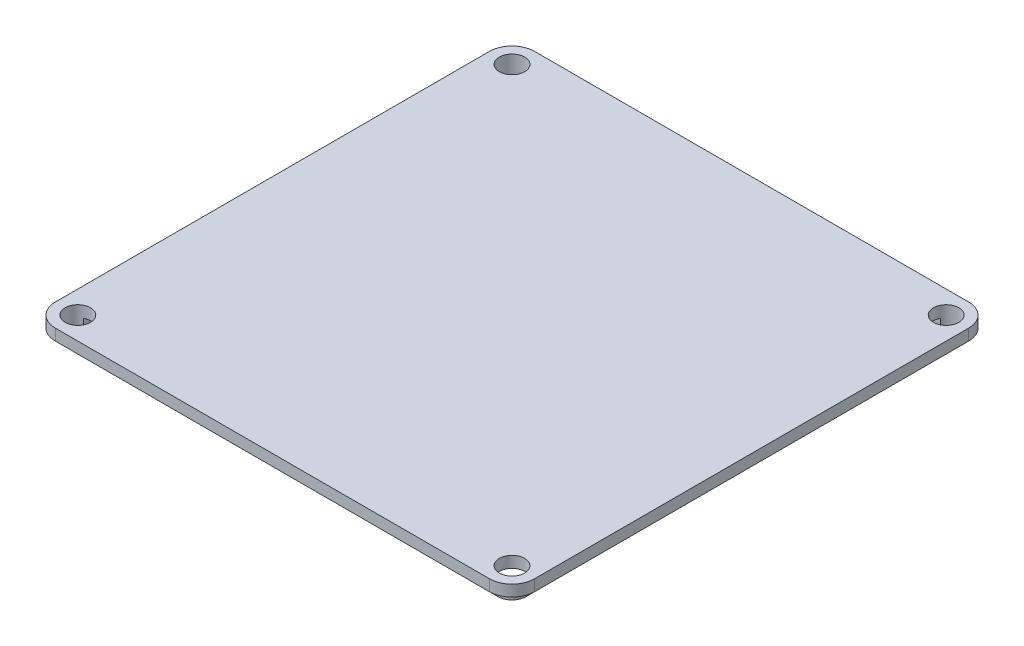
ISO-10303-21;
HEADER;
FILE_DESCRIPTION(('STEP AP214'),'2;1');
FILE_NAME('part.step','',(''),(''),'','','');
FILE_SCHEMA(('AUTOMOTIVE_DESIGN { 1 0 10303 214 1 1 1 1 }'));
ENDSEC;
DATA;
#1=APPLICATION_CONTEXT('core data for automotive mechanical design processes');
#2=APPLICATION_PROTOCOL_DEFINITION('international standard','automotive_design',2000,#1);
#3=PRODUCT_CONTEXT('',#1,'mechanical');
#4=PRODUCT('Part','Part','',(#3));
#5=PRODUCT_RELATED_PRODUCT_CATEGORY('part','',(#4));
#6=PRODUCT_DEFINITION_FORMATION('','',#4);
#7=PRODUCT_DEFINITION_CONTEXT('part definition',#1,'design');
#8=PRODUCT_DEFINITION('design','',#6,#7);
#9=PRODUCT_DEFINITION_SHAPE('','',#8);
#10=(LENGTH_UNIT() NAMED_UNIT(*) SI_UNIT(.MILLI.,.METRE.));
#11=(NAMED_UNIT(*) PLANE_ANGLE_UNIT() SI_UNIT($,.RADIAN.));
#12=(NAMED_UNIT(*) SI_UNIT($,.STERADIAN.) SOLID_ANGLE_UNIT());
#13=UNCERTAINTY_MEASURE_WITH_UNIT(LENGTH_MEASURE(1.E-05),#10,'distance_accuracy_value','');
#14=(GEOMETRIC_REPRESENTATION_CONTEXT(3) GLOBAL_UNCERTAINTY_ASSIGNED_CONTEXT((#13)) GLOBAL_UNIT_ASSIGNED_CONTEXT((#10,
#11,#12)) REPRESENTATION_CONTEXT('',''));
#15=CARTESIAN_POINT('',(0.,0.,0.));
#16=DIRECTION('',(0.,0.,1.));
#17=DIRECTION('',(1.,0.,0.));
#18=AXIS2_PLACEMENT_3D('',#15,#16,#17);
#19=CARTESIAN_POINT('',(-77.,4.,77.));
#20=DIRECTION('',(0.,-1.,0.));
#21=DIRECTION('',(0.,0.,-1.));
#22=AXIS2_PLACEMENT_3D('',#19,#20,#21);
#23=CYLINDRICAL_SURFACE('',#22,8.);
#24=CARTESIAN_POINT('',(-77.,0.,77.));
#25=DIRECTION('',(0.,1.,0.));
#26=DIRECTION('',(0.,0.,1.));
#27=AXIS2_PLACEMENT_3D('',#24,#25,#26);
#28=CIRCLE('',#27,8.);
#29=CARTESIAN_POINT('',(-85.,0.,77.));
#30=VERTEX_POINT('',#29);
#31=CARTESIAN_POINT('',(-76.9999999999999,0.,85.));
#32=VERTEX_POINT('',#31);
#33=EDGE_CURVE('E316',#30,#32,#28,.T.);
#34=ORIENTED_EDGE('',*,*,#33,.T.);
#35=DIRECTION('',(0.,-1.,0.));
#36=VECTOR('',#35,1.);
#37=CARTESIAN_POINT('',(-76.9999999999999,4.,85.));
#38=LINE('',#37,#36);
#39=CARTESIAN_POINT('',(-76.9999999999999,4.,85.));
#40=VERTEX_POINT('',#39);
#41=EDGE_CURVE('E371',#40,#32,#38,.T.);
#42=ORIENTED_EDGE('',*,*,#41,.F.);
#43=CARTESIAN_POINT('',(-77.,4.,77.));
#44=DIRECTION('',(0.,1.,0.));
#45=DIRECTION('',(0.,0.,1.));
#46=AXIS2_PLACEMENT_3D('',#43,#44,#45);
#47=CIRCLE('',#46,8.);
#48=CARTESIAN_POINT('',(-85.,4.,77.));
#49=VERTEX_POINT('',#48);
#50=EDGE_CURVE('E317',#49,#40,#47,.T.);
#51=ORIENTED_EDGE('',*,*,#50,.F.);
#52=DIRECTION('',(0.,-1.,0.));
#53=VECTOR('',#52,1.);
#54=CARTESIAN_POINT('',(-85.,4.,77.));
#55=LINE('',#54,#53);
#56=EDGE_CURVE('E335',#49,#30,#55,.T.);
#57=ORIENTED_EDGE('',*,*,#56,.T.);
#58=EDGE_LOOP('',(#34,#42,#51,#57));
#59=FACE_BOUND('',#58,.T.);
#60=ADVANCED_FACE('F40',(#59),#23,.T.);
#61=CARTESIAN_POINT('',(-76.9999999999999,4.,85.));
#62=DIRECTION('',(0.,0.,-1.));
#63=DIRECTION('',(-1.,0.,0.));
#64=AXIS2_PLACEMENT_3D('',#61,#62,#63);
#65=PLANE('',#64);
#66=DIRECTION('',(1.,0.,0.));
#67=VECTOR('',#66,1.);
#68=CARTESIAN_POINT('',(-76.9999999999999,0.,85.));
#69=LINE('',#68,#67);
#70=CARTESIAN_POINT('',(76.9999999999999,0.,85.));
#71=VERTEX_POINT('',#70);
#72=EDGE_CURVE('E338',#32,#71,#69,.T.);
#73=ORIENTED_EDGE('',*,*,#72,.T.);
#74=DIRECTION('',(0.,-1.,0.));
#75=VECTOR('',#74,1.);
#76=CARTESIAN_POINT('',(76.9999999999999,4.,85.));
#77=LINE('',#76,#75);
#78=CARTESIAN_POINT('',(76.9999999999999,4.,85.));
#79=VERTEX_POINT('',#78);
#80=EDGE_CURVE('E368',#79,#71,#77,.T.);
#81=ORIENTED_EDGE('',*,*,#80,.F.);
#82=DIRECTION('',(1.,0.,0.));
#83=VECTOR('',#82,1.);
#84=CARTESIAN_POINT('',(-76.9999999999999,4.,85.));
#85=LINE('',#84,#83);
#86=EDGE_CURVE('E320',#40,#79,#85,.T.);
#87=ORIENTED_EDGE('',*,*,#86,.F.);
#88=ORIENTED_EDGE('',*,*,#41,.T.);
#89=EDGE_LOOP('',(#73,#81,#87,#88));
#90=FACE_BOUND('',#89,.T.);
#91=ADVANCED_FACE('F447',(#90),#65,.F.);
#92=CARTESIAN_POINT('',(77.,4.,77.));
#93=DIRECTION('',(0.,-1.,0.));
#94=DIRECTION('',(0.,0.,-1.));
#95=AXIS2_PLACEMENT_3D('',#92,#93,#94);
#96=CYLINDRICAL_SURFACE('',#95,8.);
#97=CARTESIAN_POINT('',(77.,0.,77.));
#98=DIRECTION('',(0.,1.,0.));
#99=DIRECTION('',(0.,0.,1.));
#100=AXIS2_PLACEMENT_3D('',#97,#98,#99);
#101=CIRCLE('',#100,8.);
#102=CARTESIAN_POINT('',(85.,0.,77.));
#103=VERTEX_POINT('',#102);
#104=EDGE_CURVE('E340',#71,#103,#101,.T.);
#105=ORIENTED_EDGE('',*,*,#104,.T.);
#106=DIRECTION('',(0.,-1.,0.));
#107=VECTOR('',#106,1.);
#108=CARTESIAN_POINT('',(85.,4.,77.));
#109=LINE('',#108,#107);
#110=CARTESIAN_POINT('',(85.,4.,77.));
#111=VERTEX_POINT('',#110);
#112=EDGE_CURVE('E365',#111,#103,#109,.T.);
#113=ORIENTED_EDGE('',*,*,#112,.F.);
#114=CARTESIAN_POINT('',(77.,4.,77.));
#115=DIRECTION('',(0.,1.,0.));
#116=DIRECTION('',(0.,0.,1.));
#117=AXIS2_PLACEMENT_3D('',#114,#115,#116);
#118=CIRCLE('',#117,8.);
#119=EDGE_CURVE('E323',#79,#111,#118,.T.);
#120=ORIENTED_EDGE('',*,*,#119,.F.);
#121=ORIENTED_EDGE('',*,*,#80,.T.);
#122=EDGE_LOOP('',(#105,#113,#120,#121));
#123=FACE_BOUND('',#122,.T.);
#124=ADVANCED_FACE('F452',(#123),#96,.T.);
#125=CARTESIAN_POINT('',(85.,4.,-77.));
#126=DIRECTION('',(-1.,0.,0.));
#127=DIRECTION('',(0.,0.,1.));
#128=AXIS2_PLACEMENT_3D('',#125,#126,#127);
#129=PLANE('',#128);
#130=DIRECTION('',(0.,0.,-1.));
#131=VECTOR('',#130,1.);
#132=CARTESIAN_POINT('',(85.,0.,-77.));
#133=LINE('',#132,#131);
#134=CARTESIAN_POINT('',(85.,0.,-77.));
#135=VERTEX_POINT('',#134);
#136=EDGE_CURVE('E342',#103,#135,#133,.T.);
#137=ORIENTED_EDGE('',*,*,#136,.T.);
#138=DIRECTION('',(0.,-1.,0.));
#139=VECTOR('',#138,1.);
#140=CARTESIAN_POINT('',(85.,4.,-77.));
#141=LINE('',#140,#139);
#142=CARTESIAN_POINT('',(85.,4.,-77.));
#143=VERTEX_POINT('',#142);
#144=EDGE_CURVE('E362',#143,#135,#141,.T.);
#145=ORIENTED_EDGE('',*,*,#144,.F.);
#146=DIRECTION('',(0.,0.,-1.));
#147=VECTOR('',#146,1.);
#148=CARTESIAN_POINT('',(85.,4.,-77.));
#149=LINE('',#148,#147);
#150=EDGE_CURVE('E325',#111,#143,#149,.T.);
#151=ORIENTED_EDGE('',*,*,#150,.F.);
#152=ORIENTED_EDGE('',*,*,#112,.T.);
#153=EDGE_LOOP('',(#137,#145,#151,#152));
#154=FACE_BOUND('',#153,.T.);
#155=ADVANCED_FACE('F458',(#154),#129,.F.);
#156=CARTESIAN_POINT('',(77.,4.,-77.));
#157=DIRECTION('',(0.,-1.,0.));
#158=DIRECTION('',(0.,0.,-1.));
#159=AXIS2_PLACEMENT_3D('',#156,#157,#158);
#160=CYLINDRICAL_SURFACE('',#159,7.99999999999999);
#161=CARTESIAN_POINT('',(77.,0.,-77.));
#162=DIRECTION('',(0.,1.,0.));
#163=DIRECTION('',(0.,0.,-1.));
#164=AXIS2_PLACEMENT_3D('',#161,#162,#163);
#165=CIRCLE('',#164,7.99999999999999);
#166=CARTESIAN_POINT('',(77.,0.,-85.));
#167=VERTEX_POINT('',#166);
#168=EDGE_CURVE('E344',#135,#167,#165,.T.);
#169=ORIENTED_EDGE('',*,*,#168,.T.);
#170=DIRECTION('',(0.,-1.,0.));
#171=VECTOR('',#170,1.);
#172=CARTESIAN_POINT('',(77.,4.,-85.));
#173=LINE('',#172,#171);
#174=CARTESIAN_POINT('',(77.,4.,-85.));
#175=VERTEX_POINT('',#174);
#176=EDGE_CURVE('E359',#175,#167,#173,.T.);
#177=ORIENTED_EDGE('',*,*,#176,.F.);
#178=CARTESIAN_POINT('',(77.,4.,-77.));
#179=DIRECTION('',(0.,1.,0.));
#180=DIRECTION('',(0.,0.,-1.));
#181=AXIS2_PLACEMENT_3D('',#178,#179,#180);
#182=CIRCLE('',#181,7.99999999999999);
#183=EDGE_CURVE('E327',#143,#175,#182,.T.);
#184=ORIENTED_EDGE('',*,*,#183,.F.);
#185=ORIENTED_EDGE('',*,*,#144,.T.);
#186=EDGE_LOOP('',(#169,#177,#184,#185));
#187=FACE_BOUND('',#186,.T.);
#188=ADVANCED_FACE('F462',(#187),#160,.T.);
#189=CARTESIAN_POINT('',(-77.,4.,-85.));
#190=DIRECTION('',(0.,0.,1.));
#191=DIRECTION('',(1.,0.,0.));
#192=AXIS2_PLACEMENT_3D('',#189,#190,#191);
#193=PLANE('',#192);
#194=DIRECTION('',(-1.,0.,0.));
#195=VECTOR('',#194,1.);
#196=CARTESIAN_POINT('',(-77.,0.,-85.));
#197=LINE('',#196,#195);
#198=CARTESIAN_POINT('',(-77.,0.,-85.));
#199=VERTEX_POINT('',#198);
#200=EDGE_CURVE('E346',#167,#199,#197,.T.);
#201=ORIENTED_EDGE('',*,*,#200,.T.);
#202=DIRECTION('',(0.,-1.,0.));
#203=VECTOR('',#202,1.);
#204=CARTESIAN_POINT('',(-77.,4.,-85.));
#205=LINE('',#204,#203);
#206=CARTESIAN_POINT('',(-77.,4.,-85.));
#207=VERTEX_POINT('',#206);
#208=EDGE_CURVE('E356',#207,#199,#205,.T.);
#209=ORIENTED_EDGE('',*,*,#208,.F.);
#210=DIRECTION('',(-1.,0.,0.));
#211=VECTOR('',#210,1.);
#212=CARTESIAN_POINT('',(-77.,4.,-85.));
#213=LINE('',#212,#211);
#214=EDGE_CURVE('E329',#175,#207,#213,.T.);
#215=ORIENTED_EDGE('',*,*,#214,.F.);
#216=ORIENTED_EDGE('',*,*,#176,.T.);
#217=EDGE_LOOP('',(#201,#209,#215,#216));
#218=FACE_BOUND('',#217,.T.);
#219=ADVANCED_FACE('F467',(#218),#193,.F.);
#220=CARTESIAN_POINT('',(-77.,4.,-77.));
#221=DIRECTION('',(0.,-1.,0.));
#222=DIRECTION('',(0.,0.,-1.));
#223=AXIS2_PLACEMENT_3D('',#220,#221,#222);
#224=CYLINDRICAL_SURFACE('',#223,7.99999999999999);
#225=CARTESIAN_POINT('',(-77.,0.,-77.));
#226=DIRECTION('',(0.,1.,0.));
#227=DIRECTION('',(0.,0.,1.));
#228=AXIS2_PLACEMENT_3D('',#225,#226,#227);
#229=CIRCLE('',#228,7.99999999999999);
#230=CARTESIAN_POINT('',(-85.,0.,-77.));
#231=VERTEX_POINT('',#230);
#232=EDGE_CURVE('E348',#199,#231,#229,.T.);
#233=ORIENTED_EDGE('',*,*,#232,.T.);
#234=DIRECTION('',(0.,-1.,0.));
#235=VECTOR('',#234,1.);
#236=CARTESIAN_POINT('',(-85.,4.,-77.));
#237=LINE('',#236,#235);
#238=CARTESIAN_POINT('',(-85.,4.,-77.));
#239=VERTEX_POINT('',#238);
#240=EDGE_CURVE('E353',#239,#231,#237,.T.);
#241=ORIENTED_EDGE('',*,*,#240,.F.);
#242=CARTESIAN_POINT('',(-77.,4.,-77.));
#243=DIRECTION('',(0.,1.,0.));
#244=DIRECTION('',(0.,0.,1.));
#245=AXIS2_PLACEMENT_3D('',#242,#243,#244);
#246=CIRCLE('',#245,7.99999999999999);
#247=EDGE_CURVE('E331',#207,#239,#246,.T.);
#248=ORIENTED_EDGE('',*,*,#247,.F.);
#249=ORIENTED_EDGE('',*,*,#208,.T.);
#250=EDGE_LOOP('',(#233,#241,#248,#249));
#251=FACE_BOUND('',#250,.T.);
#252=ADVANCED_FACE('F471',(#251),#224,.T.);
#253=CARTESIAN_POINT('',(-85.,4.,-77.));
#254=DIRECTION('',(1.,0.,0.));
#255=DIRECTION('',(0.,0.,-1.));
#256=AXIS2_PLACEMENT_3D('',#253,#254,#255);
#257=PLANE('',#256);
#258=DIRECTION('',(0.,0.,1.));
#259=VECTOR('',#258,1.);
#260=CARTESIAN_POINT('',(-85.,0.,-77.));
#261=LINE('',#260,#259);
#262=EDGE_CURVE('E321',#231,#30,#261,.T.);
#263=ORIENTED_EDGE('',*,*,#262,.T.);
#264=ORIENTED_EDGE('',*,*,#56,.F.);
#265=DIRECTION('',(0.,0.,1.));
#266=VECTOR('',#265,1.);
#267=CARTESIAN_POINT('',(-85.,4.,-77.));
#268=LINE('',#267,#266);
#269=EDGE_CURVE('E333',#239,#49,#268,.T.);
#270=ORIENTED_EDGE('',*,*,#269,.F.);
#271=ORIENTED_EDGE('',*,*,#240,.T.);
#272=EDGE_LOOP('',(#263,#264,#270,#271));
#273=FACE_BOUND('',#272,.T.);
#274=ADVANCED_FACE('F432',(#273),#257,.F.);
#275=CARTESIAN_POINT('',(-77.,4.,77.));
#276=DIRECTION('',(0.,1.,0.));
#277=DIRECTION('',(0.,0.,1.));
#278=AXIS2_PLACEMENT_3D('',#275,#276,#277);
#279=PLANE('',#278);
#280=CARTESIAN_POINT('',(-77.,4.,77.));
#281=DIRECTION('',(0.,-1.,0.));
#282=DIRECTION('',(0.,0.,-1.));
#283=AXIS2_PLACEMENT_3D('',#280,#281,#282);
#284=CIRCLE('',#283,4.50000000000001);
#285=CARTESIAN_POINT('',(-77.,4.,72.5));
#286=VERTEX_POINT('',#285);
#287=EDGE_CURVE('E403',#286,#286,#284,.T.);
#288=ORIENTED_EDGE('',*,*,#287,.T.);
#289=EDGE_LOOP('',(#288));
#290=FACE_BOUND('',#289,.T.);
#291=CARTESIAN_POINT('',(-77.,4.,-77.));
#292=DIRECTION('',(0.,-1.,0.));
#293=DIRECTION('',(0.,0.,-1.));
#294=AXIS2_PLACEMENT_3D('',#291,#292,#293);
#295=CIRCLE('',#294,4.50000000000001);
#296=CARTESIAN_POINT('',(-77.,4.,-81.5));
#297=VERTEX_POINT('',#296);
#298=EDGE_CURVE('E402',#297,#297,#295,.T.);
#299=ORIENTED_EDGE('',*,*,#298,.T.);
#300=EDGE_LOOP('',(#299));
#301=FACE_BOUND('',#300,.T.);
#302=CARTESIAN_POINT('',(77.,4.,-77.));
#303=DIRECTION('',(0.,-1.,0.));
#304=DIRECTION('',(0.,0.,-1.));
#305=AXIS2_PLACEMENT_3D('',#302,#303,#304);
#306=CIRCLE('',#305,4.50000000000001);
#307=CARTESIAN_POINT('',(77.,4.,-81.5));
#308=VERTEX_POINT('',#307);
#309=EDGE_CURVE('E415',#308,#308,#306,.T.);
#310=ORIENTED_EDGE('',*,*,#309,.T.);
#311=EDGE_LOOP('',(#310));
#312=FACE_BOUND('',#311,.T.);
#313=CARTESIAN_POINT('',(77.,4.,77.));
#314=DIRECTION('',(0.,-1.,0.));
#315=DIRECTION('',(0.,0.,-1.));
#316=AXIS2_PLACEMENT_3D('',#313,#314,#315);
#317=CIRCLE('',#316,4.50000000000001);
#318=CARTESIAN_POINT('',(77.,4.,72.5));
#319=VERTEX_POINT('',#318);
#320=EDGE_CURVE('E223',#319,#319,#317,.T.);
#321=ORIENTED_EDGE('',*,*,#320,.T.);
#322=EDGE_LOOP('',(#321));
#323=FACE_BOUND('',#322,.T.);
#324=ORIENTED_EDGE('',*,*,#50,.T.);
#325=ORIENTED_EDGE('',*,*,#86,.T.);
#326=ORIENTED_EDGE('',*,*,#119,.T.);
#327=ORIENTED_EDGE('',*,*,#150,.T.);
#328=ORIENTED_EDGE('',*,*,#183,.T.);
#329=ORIENTED_EDGE('',*,*,#214,.T.);
#330=ORIENTED_EDGE('',*,*,#247,.T.);
#331=ORIENTED_EDGE('',*,*,#269,.T.);
#332=EDGE_LOOP('',(#324,#325,#326,#327,#328,#329,#330,#331));
#333=FACE_BOUND('',#332,.T.);
#334=ADVANCED_FACE('F428',(#290,#301,#312,#323,#333),#279,.T.);
#335=CARTESIAN_POINT('',(-77.,0.,77.));
#336=DIRECTION('',(0.,1.,0.));
#337=DIRECTION('',(0.,0.,1.));
#338=AXIS2_PLACEMENT_3D('',#335,#336,#337);
#339=PLANE('',#338);
#340=DIRECTION('',(-1.,0.,0.));
#341=VECTOR('',#340,1.);
#342=CARTESIAN_POINT('',(0.,0.,82.));
#343=LINE('',#342,#341);
#344=CARTESIAN_POINT('',(77.,0.,82.));
#345=VERTEX_POINT('',#344);
#346=CARTESIAN_POINT('',(-77.,0.,82.));
#347=VERTEX_POINT('',#346);
#348=EDGE_CURVE('E273',#345,#347,#343,.T.);
#349=ORIENTED_EDGE('',*,*,#348,.F.);
#350=CARTESIAN_POINT('',(77.,0.,77.));
#351=DIRECTION('',(0.,-1.,0.));
#352=DIRECTION('',(0.,0.,-1.));
#353=AXIS2_PLACEMENT_3D('',#350,#351,#352);
#354=CIRCLE('',#353,5.);
#355=CARTESIAN_POINT('',(82.,0.,77.));
#356=VERTEX_POINT('',#355);
#357=EDGE_CURVE('E230',#356,#345,#354,.T.);
#358=ORIENTED_EDGE('',*,*,#357,.F.);
#359=DIRECTION('',(0.,0.,1.));
#360=VECTOR('',#359,1.);
#361=CARTESIAN_POINT('',(82.,0.,0.));
#362=LINE('',#361,#360);
#363=CARTESIAN_POINT('',(82.,0.,-77.));
#364=VERTEX_POINT('',#363);
#365=EDGE_CURVE('E236',#364,#356,#362,.T.);
#366=ORIENTED_EDGE('',*,*,#365,.F.);
#367=CARTESIAN_POINT('',(77.,0.,-77.));
#368=DIRECTION('',(0.,-1.,0.));
#369=DIRECTION('',(0.,0.,-1.));
#370=AXIS2_PLACEMENT_3D('',#367,#368,#369);
#371=CIRCLE('',#370,4.99999999999999);
#372=CARTESIAN_POINT('',(77.,0.,-82.));
#373=VERTEX_POINT('',#372);
#374=EDGE_CURVE('E288',#373,#364,#371,.T.);
#375=ORIENTED_EDGE('',*,*,#374,.F.);
#376=DIRECTION('',(1.,0.,0.));
#377=VECTOR('',#376,1.);
#378=CARTESIAN_POINT('',(0.,0.,-82.));
#379=LINE('',#378,#377);
#380=CARTESIAN_POINT('',(-77.,0.,-82.));
#381=VERTEX_POINT('',#380);
#382=EDGE_CURVE('E285',#381,#373,#379,.T.);
#383=ORIENTED_EDGE('',*,*,#382,.F.);
#384=CARTESIAN_POINT('',(-77.,0.,-77.));
#385=DIRECTION('',(0.,-1.,0.));
#386=DIRECTION('',(0.,0.,-1.));
#387=AXIS2_PLACEMENT_3D('',#384,#385,#386);
#388=CIRCLE('',#387,4.99999999999998);
#389=CARTESIAN_POINT('',(-82.,0.,-77.));
#390=VERTEX_POINT('',#389);
#391=EDGE_CURVE('E282',#390,#381,#388,.T.);
#392=ORIENTED_EDGE('',*,*,#391,.F.);
#393=DIRECTION('',(0.,0.,-1.));
#394=VECTOR('',#393,1.);
#395=CARTESIAN_POINT('',(-82.,0.,0.));
#396=LINE('',#395,#394);
#397=CARTESIAN_POINT('',(-82.,0.,77.));
#398=VERTEX_POINT('',#397);
#399=EDGE_CURVE('E279',#398,#390,#396,.T.);
#400=ORIENTED_EDGE('',*,*,#399,.F.);
#401=CARTESIAN_POINT('',(-77.,0.,77.));
#402=DIRECTION('',(0.,-1.,0.));
#403=DIRECTION('',(0.,0.,-1.));
#404=AXIS2_PLACEMENT_3D('',#401,#402,#403);
#405=CIRCLE('',#404,5.);
#406=EDGE_CURVE('E276',#347,#398,#405,.T.);
#407=ORIENTED_EDGE('',*,*,#406,.F.);
#408=EDGE_LOOP('',(#349,#358,#366,#375,#383,#392,#400,#407));
#409=FACE_BOUND('',#408,.T.);
#410=ORIENTED_EDGE('',*,*,#33,.F.);
#411=ORIENTED_EDGE('',*,*,#262,.F.);
#412=ORIENTED_EDGE('',*,*,#232,.F.);
#413=ORIENTED_EDGE('',*,*,#200,.F.);
#414=ORIENTED_EDGE('',*,*,#168,.F.);
#415=ORIENTED_EDGE('',*,*,#136,.F.);
#416=ORIENTED_EDGE('',*,*,#104,.F.);
#417=ORIENTED_EDGE('',*,*,#72,.F.);
#418=EDGE_LOOP('',(#410,#411,#412,#413,#414,#415,#416,#417));
#419=FACE_BOUND('',#418,.T.);
#420=ADVANCED_FACE('F431',(#409,#419),#339,.F.);
#421=CARTESIAN_POINT('',(0.,-3.,82.));
#422=DIRECTION('',(0.,0.,-1.));
#423=DIRECTION('',(-1.,0.,0.));
#424=AXIS2_PLACEMENT_3D('',#421,#422,#423);
#425=PLANE('',#424);
#426=ORIENTED_EDGE('',*,*,#348,.T.);
#427=DIRECTION('',(0.,1.,0.));
#428=VECTOR('',#427,1.);
#429=CARTESIAN_POINT('',(-76.9999999999999,-3.,82.));
#430=LINE('',#429,#428);
#431=CARTESIAN_POINT('',(-76.9999999999999,-3.,82.));
#432=VERTEX_POINT('',#431);
#433=EDGE_CURVE('E313',#432,#347,#430,.T.);
#434=ORIENTED_EDGE('',*,*,#433,.F.);
#435=DIRECTION('',(-1.,0.,0.));
#436=VECTOR('',#435,1.);
#437=CARTESIAN_POINT('',(0.,-3.,82.));
#438=LINE('',#437,#436);
#439=CARTESIAN_POINT('',(77.,-3.,82.));
#440=VERTEX_POINT('',#439);
#441=EDGE_CURVE('E244',#440,#432,#438,.T.);
#442=ORIENTED_EDGE('',*,*,#441,.F.);
#443=DIRECTION('',(0.,1.,0.));
#444=VECTOR('',#443,1.);
#445=CARTESIAN_POINT('',(77.,-3.,82.));
#446=LINE('',#445,#444);
#447=EDGE_CURVE('E261',#440,#345,#446,.T.);
#448=ORIENTED_EDGE('',*,*,#447,.T.);
#449=EDGE_LOOP('',(#426,#434,#442,#448));
#450=FACE_BOUND('',#449,.T.);
#451=ADVANCED_FACE('F477',(#450),#425,.F.);
#452=CARTESIAN_POINT('',(-77.,-3.,77.));
#453=DIRECTION('',(0.,1.,0.));
#454=DIRECTION('',(0.,0.,1.));
#455=AXIS2_PLACEMENT_3D('',#452,#453,#454);
#456=CYLINDRICAL_SURFACE('',#455,5.);
#457=ORIENTED_EDGE('',*,*,#406,.T.);
#458=DIRECTION('',(0.,1.,0.));
#459=VECTOR('',#458,1.);
#460=CARTESIAN_POINT('',(-82.,-3.,77.));
#461=LINE('',#460,#459);
#462=CARTESIAN_POINT('',(-82.,-3.,77.));
#463=VERTEX_POINT('',#462);
#464=EDGE_CURVE('E310',#463,#398,#461,.T.);
#465=ORIENTED_EDGE('',*,*,#464,.F.);
#466=CARTESIAN_POINT('',(-77.,-3.,77.));
#467=DIRECTION('',(0.,-1.,0.));
#468=DIRECTION('',(0.,0.,-1.));
#469=AXIS2_PLACEMENT_3D('',#466,#467,#468);
#470=CIRCLE('',#469,5.);
#471=EDGE_CURVE('E247',#432,#463,#470,.T.);
#472=ORIENTED_EDGE('',*,*,#471,.F.);
#473=ORIENTED_EDGE('',*,*,#433,.T.);
#474=EDGE_LOOP('',(#457,#465,#472,#473));
#475=FACE_BOUND('',#474,.T.);
#476=ADVANCED_FACE('F483',(#475),#456,.T.);
#477=CARTESIAN_POINT('',(-82.,-3.,0.));
#478=DIRECTION('',(1.,0.,0.));
#479=DIRECTION('',(0.,0.,-1.));
#480=AXIS2_PLACEMENT_3D('',#477,#478,#479);
#481=PLANE('',#480);
#482=ORIENTED_EDGE('',*,*,#399,.T.);
#483=DIRECTION('',(0.,1.,0.));
#484=VECTOR('',#483,1.);
#485=CARTESIAN_POINT('',(-82.,-3.,-77.));
#486=LINE('',#485,#484);
#487=CARTESIAN_POINT('',(-82.,-3.,-77.));
#488=VERTEX_POINT('',#487);
#489=EDGE_CURVE('E307',#488,#390,#486,.T.);
#490=ORIENTED_EDGE('',*,*,#489,.F.);
#491=DIRECTION('',(0.,0.,-1.));
#492=VECTOR('',#491,1.);
#493=CARTESIAN_POINT('',(-82.,-3.,0.));
#494=LINE('',#493,#492);
#495=EDGE_CURVE('E249',#463,#488,#494,.T.);
#496=ORIENTED_EDGE('',*,*,#495,.F.);
#497=ORIENTED_EDGE('',*,*,#464,.T.);
#498=EDGE_LOOP('',(#482,#490,#496,#497));
#499=FACE_BOUND('',#498,.T.);
#500=ADVANCED_FACE('F662',(#499),#481,.F.);
#501=CARTESIAN_POINT('',(-77.,-3.,-77.));
#502=DIRECTION('',(0.,1.,0.));
#503=DIRECTION('',(0.,0.,1.));
#504=AXIS2_PLACEMENT_3D('',#501,#502,#503);
#505=CYLINDRICAL_SURFACE('',#504,4.99999999999998);
#506=ORIENTED_EDGE('',*,*,#391,.T.);
#507=DIRECTION('',(0.,1.,0.));
#508=VECTOR('',#507,1.);
#509=CARTESIAN_POINT('',(-77.,-3.,-82.));
#510=LINE('',#509,#508);
#511=CARTESIAN_POINT('',(-77.,-3.,-82.));
#512=VERTEX_POINT('',#511);
#513=EDGE_CURVE('E304',#512,#381,#510,.T.);
#514=ORIENTED_EDGE('',*,*,#513,.F.);
#515=CARTESIAN_POINT('',(-77.,-3.,-77.));
#516=DIRECTION('',(0.,-1.,0.));
#517=DIRECTION('',(0.,0.,-1.));
#518=AXIS2_PLACEMENT_3D('',#515,#516,#517);
#519=CIRCLE('',#518,4.99999999999998);
#520=EDGE_CURVE('E251',#488,#512,#519,.T.);
#521=ORIENTED_EDGE('',*,*,#520,.F.);
#522=ORIENTED_EDGE('',*,*,#489,.T.);
#523=EDGE_LOOP('',(#506,#514,#521,#522));
#524=FACE_BOUND('',#523,.T.);
#525=ADVANCED_FACE('F652',(#524),#505,.T.);
#526=CARTESIAN_POINT('',(0.,-3.,-82.));
#527=DIRECTION('',(0.,0.,1.));
#528=DIRECTION('',(1.,0.,0.));
#529=AXIS2_PLACEMENT_3D('',#526,#527,#528);
#530=PLANE('',#529);
#531=ORIENTED_EDGE('',*,*,#382,.T.);
#532=DIRECTION('',(0.,1.,0.));
#533=VECTOR('',#532,1.);
#534=CARTESIAN_POINT('',(77.,-3.,-82.));
#535=LINE('',#534,#533);
#536=CARTESIAN_POINT('',(77.,-3.,-82.));
#537=VERTEX_POINT('',#536);
#538=EDGE_CURVE('E301',#537,#373,#535,.T.);
#539=ORIENTED_EDGE('',*,*,#538,.F.);
#540=DIRECTION('',(1.,0.,0.));
#541=VECTOR('',#540,1.);
#542=CARTESIAN_POINT('',(0.,-3.,-82.));
#543=LINE('',#542,#541);
#544=EDGE_CURVE('E253',#512,#537,#543,.T.);
#545=ORIENTED_EDGE('',*,*,#544,.F.);
#546=ORIENTED_EDGE('',*,*,#513,.T.);
#547=EDGE_LOOP('',(#531,#539,#545,#546));
#548=FACE_BOUND('',#547,.T.);
#549=ADVANCED_FACE('F642',(#548),#530,.F.);
#550=CARTESIAN_POINT('',(77.,-3.,-77.));
#551=DIRECTION('',(0.,1.,0.));
#552=DIRECTION('',(0.,0.,1.));
#553=AXIS2_PLACEMENT_3D('',#550,#551,#552);
#554=CYLINDRICAL_SURFACE('',#553,4.99999999999999);
#555=ORIENTED_EDGE('',*,*,#374,.T.);
#556=DIRECTION('',(0.,1.,0.));
#557=VECTOR('',#556,1.);
#558=CARTESIAN_POINT('',(82.,-3.,-77.));
#559=LINE('',#558,#557);
#560=CARTESIAN_POINT('',(82.,-3.,-77.));
#561=VERTEX_POINT('',#560);
#562=EDGE_CURVE('E298',#561,#364,#559,.T.);
#563=ORIENTED_EDGE('',*,*,#562,.F.);
#564=CARTESIAN_POINT('',(77.,-3.,-77.));
#565=DIRECTION('',(0.,-1.,0.));
#566=DIRECTION('',(0.,0.,-1.));
#567=AXIS2_PLACEMENT_3D('',#564,#565,#566);
#568=CIRCLE('',#567,4.99999999999999);
#569=EDGE_CURVE('E255',#537,#561,#568,.T.);
#570=ORIENTED_EDGE('',*,*,#569,.F.);
#571=ORIENTED_EDGE('',*,*,#538,.T.);
#572=EDGE_LOOP('',(#555,#563,#570,#571));
#573=FACE_BOUND('',#572,.T.);
#574=ADVANCED_FACE('F633',(#573),#554,.T.);
#575=CARTESIAN_POINT('',(82.,-3.,0.));
#576=DIRECTION('',(-1.,0.,0.));
#577=DIRECTION('',(0.,0.,1.));
#578=AXIS2_PLACEMENT_3D('',#575,#576,#577);
#579=PLANE('',#578);
#580=ORIENTED_EDGE('',*,*,#365,.T.);
#581=DIRECTION('',(0.,1.,0.));
#582=VECTOR('',#581,1.);
#583=CARTESIAN_POINT('',(82.,-3.,77.));
#584=LINE('',#583,#582);
#585=CARTESIAN_POINT('',(82.,-3.,77.));
#586=VERTEX_POINT('',#585);
#587=EDGE_CURVE('E295',#586,#356,#584,.T.);
#588=ORIENTED_EDGE('',*,*,#587,.F.);
#589=DIRECTION('',(0.,0.,1.));
#590=VECTOR('',#589,1.);
#591=CARTESIAN_POINT('',(82.,-3.,0.));
#592=LINE('',#591,#590);
#593=EDGE_CURVE('E257',#561,#586,#592,.T.);
#594=ORIENTED_EDGE('',*,*,#593,.F.);
#595=ORIENTED_EDGE('',*,*,#562,.T.);
#596=EDGE_LOOP('',(#580,#588,#594,#595));
#597=FACE_BOUND('',#596,.T.);
#598=ADVANCED_FACE('F530',(#597),#579,.F.);
#599=CARTESIAN_POINT('',(79.,-3.,0.));
#600=DIRECTION('',(-1.,0.,0.));
#601=DIRECTION('',(0.,0.,1.));
#602=AXIS2_PLACEMENT_3D('',#599,#600,#601);
#603=PLANE('',#602);
#604=DIRECTION('',(0.,-1.,0.));
#605=VECTOR('',#604,1.);
#606=CARTESIAN_POINT('',(79.,4.,-72.9688711258507));
#607=LINE('',#606,#605);
#608=CARTESIAN_POINT('',(79.,-3.,-72.9688711258507));
#609=VERTEX_POINT('',#608);
#610=CARTESIAN_POINT('',(79.,0.,-72.9688711258507));
#611=VERTEX_POINT('',#610);
#612=EDGE_CURVE('E228',#609,#611,#607,.F.);
#613=ORIENTED_EDGE('',*,*,#612,.F.);
#614=DIRECTION('',(0.,0.,1.));
#615=VECTOR('',#614,1.);
#616=CARTESIAN_POINT('',(79.,-3.,0.));
#617=LINE('',#616,#615);
#618=CARTESIAN_POINT('',(79.,-3.,72.9688711258507));
#619=VERTEX_POINT('',#618);
#620=EDGE_CURVE('E220',#609,#619,#617,.T.);
#621=ORIENTED_EDGE('',*,*,#620,.T.);
#622=DIRECTION('',(0.,-1.,0.));
#623=VECTOR('',#622,1.);
#624=CARTESIAN_POINT('',(79.,4.,72.9688711258507));
#625=LINE('',#624,#623);
#626=CARTESIAN_POINT('',(79.,0.,72.9688711258507));
#627=VERTEX_POINT('',#626);
#628=EDGE_CURVE('E198',#627,#619,#625,.T.);
#629=ORIENTED_EDGE('',*,*,#628,.F.);
#630=DIRECTION('',(0.,0.,1.));
#631=VECTOR('',#630,1.);
#632=CARTESIAN_POINT('',(79.,0.,0.));
#633=LINE('',#632,#631);
#634=EDGE_CURVE('E262',#611,#627,#633,.T.);
#635=ORIENTED_EDGE('',*,*,#634,.F.);
#636=EDGE_LOOP('',(#613,#621,#629,#635));
#637=FACE_BOUND('',#636,.T.);
#638=ADVANCED_FACE('F227',(#637),#603,.T.);
#639=CARTESIAN_POINT('',(0.,-3.,-79.));
#640=DIRECTION('',(0.,0.,1.));
#641=DIRECTION('',(1.,0.,0.));
#642=AXIS2_PLACEMENT_3D('',#639,#640,#641);
#643=PLANE('',#642);
#644=DIRECTION('',(0.,-1.,0.));
#645=VECTOR('',#644,1.);
#646=CARTESIAN_POINT('',(-72.9688711258507,4.,-79.));
#647=LINE('',#646,#645);
#648=CARTESIAN_POINT('',(-72.9688711258507,-3.,-79.));
#649=VERTEX_POINT('',#648);
#650=CARTESIAN_POINT('',(-72.9688711258507,0.,-79.));
#651=VERTEX_POINT('',#650);
#652=EDGE_CURVE('E54',#649,#651,#647,.F.);
#653=ORIENTED_EDGE('',*,*,#652,.F.);
#654=DIRECTION('',(1.,0.,0.));
#655=VECTOR('',#654,1.);
#656=CARTESIAN_POINT('',(0.,-3.,-79.));
#657=LINE('',#656,#655);
#658=CARTESIAN_POINT('',(72.9688711258507,-3.,-79.));
#659=VERTEX_POINT('',#658);
#660=EDGE_CURVE('E229',#649,#659,#657,.T.);
#661=ORIENTED_EDGE('',*,*,#660,.T.);
#662=DIRECTION('',(0.,-1.,0.));
#663=VECTOR('',#662,1.);
#664=CARTESIAN_POINT('',(72.9688711258507,4.,-79.));
#665=LINE('',#664,#663);
#666=CARTESIAN_POINT('',(72.9688711258507,0.,-79.));
#667=VERTEX_POINT('',#666);
#668=EDGE_CURVE('E210',#667,#659,#665,.T.);
#669=ORIENTED_EDGE('',*,*,#668,.F.);
#670=DIRECTION('',(1.,0.,0.));
#671=VECTOR('',#670,1.);
#672=CARTESIAN_POINT('',(0.,0.,-79.));
#673=LINE('',#672,#671);
#674=EDGE_CURVE('E264',#651,#667,#673,.T.);
#675=ORIENTED_EDGE('',*,*,#674,.F.);
#676=EDGE_LOOP('',(#653,#661,#669,#675));
#677=FACE_BOUND('',#676,.T.);
#678=ADVANCED_FACE('F384',(#677),#643,.T.);
#679=CARTESIAN_POINT('',(-79.,-3.,0.));
#680=DIRECTION('',(1.,0.,0.));
#681=DIRECTION('',(0.,0.,-1.));
#682=AXIS2_PLACEMENT_3D('',#679,#680,#681);
#683=PLANE('',#682);
#684=DIRECTION('',(0.,-1.,0.));
#685=VECTOR('',#684,1.);
#686=CARTESIAN_POINT('',(-79.,4.,72.9688711258507));
#687=LINE('',#686,#685);
#688=CARTESIAN_POINT('',(-79.,-3.,72.9688711258507));
#689=VERTEX_POINT('',#688);
#690=CARTESIAN_POINT('',(-79.,0.,72.9688711258507));
#691=VERTEX_POINT('',#690);
#692=EDGE_CURVE('E62',#689,#691,#687,.F.);
#693=ORIENTED_EDGE('',*,*,#692,.F.);
#694=DIRECTION('',(0.,0.,-1.));
#695=VECTOR('',#694,1.);
#696=CARTESIAN_POINT('',(-79.,-3.,0.));
#697=LINE('',#696,#695);
#698=CARTESIAN_POINT('',(-79.,-3.,-72.9688711258507));
#699=VERTEX_POINT('',#698);
#700=EDGE_CURVE('E233',#689,#699,#697,.T.);
#701=ORIENTED_EDGE('',*,*,#700,.T.);
#702=DIRECTION('',(0.,-1.,0.));
#703=VECTOR('',#702,1.);
#704=CARTESIAN_POINT('',(-79.,4.,-72.9688711258507));
#705=LINE('',#704,#703);
#706=CARTESIAN_POINT('',(-79.,0.,-72.9688711258507));
#707=VERTEX_POINT('',#706);
#708=EDGE_CURVE('E388',#707,#699,#705,.T.);
#709=ORIENTED_EDGE('',*,*,#708,.F.);
#710=DIRECTION('',(0.,0.,-1.));
#711=VECTOR('',#710,1.);
#712=CARTESIAN_POINT('',(-79.,0.,0.));
#713=LINE('',#712,#711);
#714=EDGE_CURVE('E267',#691,#707,#713,.T.);
#715=ORIENTED_EDGE('',*,*,#714,.F.);
#716=EDGE_LOOP('',(#693,#701,#709,#715));
#717=FACE_BOUND('',#716,.T.);
#718=ADVANCED_FACE('F421',(#717),#683,.T.);
#719=CARTESIAN_POINT('',(0.,-3.,79.));
#720=DIRECTION('',(0.,0.,-1.));
#721=DIRECTION('',(-1.,0.,0.));
#722=AXIS2_PLACEMENT_3D('',#719,#720,#721);
#723=PLANE('',#722);
#724=DIRECTION('',(0.,-1.,0.));
#725=VECTOR('',#724,1.);
#726=CARTESIAN_POINT('',(-72.9688711258507,4.,79.));
#727=LINE('',#726,#725);
#728=CARTESIAN_POINT('',(-72.9688711258507,0.,79.));
#729=VERTEX_POINT('',#728);
#730=CARTESIAN_POINT('',(-72.9688711258507,-3.,79.));
#731=VERTEX_POINT('',#730);
#732=EDGE_CURVE('E393',#729,#731,#727,.T.);
#733=ORIENTED_EDGE('',*,*,#732,.F.);
#734=DIRECTION('',(-1.,0.,0.));
#735=VECTOR('',#734,1.);
#736=CARTESIAN_POINT('',(0.,0.,79.));
#737=LINE('',#736,#735);
#738=CARTESIAN_POINT('',(72.9688711258507,0.,79.));
#739=VERTEX_POINT('',#738);
#740=EDGE_CURVE('E270',#739,#729,#737,.T.);
#741=ORIENTED_EDGE('',*,*,#740,.F.);
#742=DIRECTION('',(0.,-1.,0.));
#743=VECTOR('',#742,1.);
#744=CARTESIAN_POINT('',(72.9688711258507,4.,79.));
#745=LINE('',#744,#743);
#746=CARTESIAN_POINT('',(72.9688711258507,-3.,79.));
#747=VERTEX_POINT('',#746);
#748=EDGE_CURVE('E211',#747,#739,#745,.F.);
#749=ORIENTED_EDGE('',*,*,#748,.F.);
#750=DIRECTION('',(-1.,0.,0.));
#751=VECTOR('',#750,1.);
#752=CARTESIAN_POINT('',(0.,-3.,79.));
#753=LINE('',#752,#751);
#754=EDGE_CURVE('E222',#747,#731,#753,.T.);
#755=ORIENTED_EDGE('',*,*,#754,.T.);
#756=EDGE_LOOP('',(#733,#741,#749,#755));
#757=FACE_BOUND('',#756,.T.);
#758=ADVANCED_FACE('F405',(#757),#723,.T.);
#759=CARTESIAN_POINT('',(77.,-3.,77.));
#760=DIRECTION('',(0.,1.,0.));
#761=DIRECTION('',(0.,0.,1.));
#762=AXIS2_PLACEMENT_3D('',#759,#760,#761);
#763=CYLINDRICAL_SURFACE('',#762,5.);
#764=ORIENTED_EDGE('',*,*,#357,.T.);
#765=ORIENTED_EDGE('',*,*,#447,.F.);
#766=CARTESIAN_POINT('',(77.,-3.,77.));
#767=DIRECTION('',(0.,-1.,0.));
#768=DIRECTION('',(0.,0.,-1.));
#769=AXIS2_PLACEMENT_3D('',#766,#767,#768);
#770=CIRCLE('',#769,5.);
#771=EDGE_CURVE('E259',#586,#440,#770,.T.);
#772=ORIENTED_EDGE('',*,*,#771,.F.);
#773=ORIENTED_EDGE('',*,*,#587,.T.);
#774=EDGE_LOOP('',(#764,#765,#772,#773));
#775=FACE_BOUND('',#774,.T.);
#776=ADVANCED_FACE('F521',(#775),#763,.T.);
#777=CARTESIAN_POINT('',(0.,-3.,0.));
#778=DIRECTION('',(0.,-1.,0.));
#779=DIRECTION('',(0.,0.,-1.));
#780=AXIS2_PLACEMENT_3D('',#777,#778,#779);
#781=PLANE('',#780);
#782=CARTESIAN_POINT('',(-77.,-3.,77.));
#783=DIRECTION('',(0.,-1.,0.));
#784=DIRECTION('',(0.,0.,-1.));
#785=AXIS2_PLACEMENT_3D('',#782,#783,#784);
#786=CIRCLE('',#785,4.50000000000001);
#787=EDGE_CURVE('E397',#731,#689,#786,.T.);
#788=ORIENTED_EDGE('',*,*,#787,.F.);
#789=ORIENTED_EDGE('',*,*,#754,.F.);
#790=CARTESIAN_POINT('',(77.,-3.,77.));
#791=DIRECTION('',(0.,-1.,0.));
#792=DIRECTION('',(0.,0.,-1.));
#793=AXIS2_PLACEMENT_3D('',#790,#791,#792);
#794=CIRCLE('',#793,4.50000000000001);
#795=EDGE_CURVE('E202',#619,#747,#794,.T.);
#796=ORIENTED_EDGE('',*,*,#795,.F.);
#797=ORIENTED_EDGE('',*,*,#620,.F.);
#798=CARTESIAN_POINT('',(77.,-3.,-77.));
#799=DIRECTION('',(0.,-1.,0.));
#800=DIRECTION('',(0.,0.,-1.));
#801=AXIS2_PLACEMENT_3D('',#798,#799,#800);
#802=CIRCLE('',#801,4.50000000000001);
#803=EDGE_CURVE('E224',#659,#609,#802,.T.);
#804=ORIENTED_EDGE('',*,*,#803,.F.);
#805=ORIENTED_EDGE('',*,*,#660,.F.);
#806=CARTESIAN_POINT('',(-77.,-3.,-77.));
#807=DIRECTION('',(0.,-1.,0.));
#808=DIRECTION('',(0.,0.,-1.));
#809=AXIS2_PLACEMENT_3D('',#806,#807,#808);
#810=CIRCLE('',#809,4.50000000000001);
#811=EDGE_CURVE('E413',#699,#649,#810,.T.);
#812=ORIENTED_EDGE('',*,*,#811,.F.);
#813=ORIENTED_EDGE('',*,*,#700,.F.);
#814=EDGE_LOOP('',(#788,#789,#796,#797,#804,#805,#812,#813));
#815=FACE_BOUND('',#814,.T.);
#816=ORIENTED_EDGE('',*,*,#441,.T.);
#817=ORIENTED_EDGE('',*,*,#471,.T.);
#818=ORIENTED_EDGE('',*,*,#495,.T.);
#819=ORIENTED_EDGE('',*,*,#520,.T.);
#820=ORIENTED_EDGE('',*,*,#544,.T.);
#821=ORIENTED_EDGE('',*,*,#569,.T.);
#822=ORIENTED_EDGE('',*,*,#593,.T.);
#823=ORIENTED_EDGE('',*,*,#771,.T.);
#824=EDGE_LOOP('',(#816,#817,#818,#819,#820,#821,#822,#823));
#825=FACE_BOUND('',#824,.T.);
#826=ADVANCED_FACE('F217',(#815,#825),#781,.T.);
#827=ORIENTED_EDGE('',*,*,#740,.T.);
#828=CARTESIAN_POINT('',(-77.,0.,77.));
#829=DIRECTION('',(0.,1.,0.));
#830=DIRECTION('',(0.,0.,1.));
#831=AXIS2_PLACEMENT_3D('',#828,#829,#830);
#832=CIRCLE('',#831,4.50000000000001);
#833=EDGE_CURVE('E11',#729,#691,#832,.T.);
#834=ORIENTED_EDGE('',*,*,#833,.T.);
#835=ORIENTED_EDGE('',*,*,#714,.T.);
#836=CARTESIAN_POINT('',(-77.,0.,-77.));
#837=DIRECTION('',(0.,1.,0.));
#838=DIRECTION('',(0.,0.,1.));
#839=AXIS2_PLACEMENT_3D('',#836,#837,#838);
#840=CIRCLE('',#839,4.50000000000001);
#841=EDGE_CURVE('E47',#707,#651,#840,.T.);
#842=ORIENTED_EDGE('',*,*,#841,.T.);
#843=ORIENTED_EDGE('',*,*,#674,.T.);
#844=CARTESIAN_POINT('',(77.,0.,-77.));
#845=DIRECTION('',(0.,1.,0.));
#846=DIRECTION('',(0.,0.,1.));
#847=AXIS2_PLACEMENT_3D('',#844,#845,#846);
#848=CIRCLE('',#847,4.50000000000001);
#849=EDGE_CURVE('E375',#667,#611,#848,.T.);
#850=ORIENTED_EDGE('',*,*,#849,.T.);
#851=ORIENTED_EDGE('',*,*,#634,.T.);
#852=CARTESIAN_POINT('',(77.,0.,77.));
#853=DIRECTION('',(0.,1.,0.));
#854=DIRECTION('',(0.,0.,1.));
#855=AXIS2_PLACEMENT_3D('',#852,#853,#854);
#856=CIRCLE('',#855,4.50000000000001);
#857=EDGE_CURVE('E205',#627,#739,#856,.T.);
#858=ORIENTED_EDGE('',*,*,#857,.T.);
#859=EDGE_LOOP('',(#827,#834,#835,#842,#843,#850,#851,#858));
#860=FACE_BOUND('',#859,.T.);
#861=ADVANCED_FACE('F379',(#860),#339,.F.);
#862=CARTESIAN_POINT('',(77.,4.,77.));
#863=DIRECTION('',(0.,-1.,0.));
#864=DIRECTION('',(0.,0.,-1.));
#865=AXIS2_PLACEMENT_3D('',#862,#863,#864);
#866=CYLINDRICAL_SURFACE('',#865,4.50000000000001);
#867=ORIENTED_EDGE('',*,*,#628,.T.);
#868=ORIENTED_EDGE('',*,*,#795,.T.);
#869=ORIENTED_EDGE('',*,*,#748,.T.);
#870=ORIENTED_EDGE('',*,*,#857,.F.);
#871=EDGE_LOOP('',(#867,#868,#869,#870));
#872=FACE_BOUND('',#871,.T.);
#873=ORIENTED_EDGE('',*,*,#320,.F.);
#874=EDGE_LOOP('',(#873));
#875=FACE_BOUND('',#874,.T.);
#876=ADVANCED_FACE('F200',(#872,#875),#866,.F.);
#877=CARTESIAN_POINT('',(77.,4.,-77.));
#878=DIRECTION('',(0.,-1.,0.));
#879=DIRECTION('',(0.,0.,-1.));
#880=AXIS2_PLACEMENT_3D('',#877,#878,#879);
#881=CYLINDRICAL_SURFACE('',#880,4.50000000000001);
#882=ORIENTED_EDGE('',*,*,#612,.T.);
#883=ORIENTED_EDGE('',*,*,#849,.F.);
#884=ORIENTED_EDGE('',*,*,#668,.T.);
#885=ORIENTED_EDGE('',*,*,#803,.T.);
#886=EDGE_LOOP('',(#882,#883,#884,#885));
#887=FACE_BOUND('',#886,.T.);
#888=ORIENTED_EDGE('',*,*,#309,.F.);
#889=EDGE_LOOP('',(#888));
#890=FACE_BOUND('',#889,.T.);
#891=ADVANCED_FACE('F418',(#887,#890),#881,.F.);
#892=CARTESIAN_POINT('',(-77.,4.,-77.));
#893=DIRECTION('',(0.,-1.,0.));
#894=DIRECTION('',(0.,0.,-1.));
#895=AXIS2_PLACEMENT_3D('',#892,#893,#894);
#896=CYLINDRICAL_SURFACE('',#895,4.50000000000001);
#897=ORIENTED_EDGE('',*,*,#652,.T.);
#898=ORIENTED_EDGE('',*,*,#841,.F.);
#899=ORIENTED_EDGE('',*,*,#708,.T.);
#900=ORIENTED_EDGE('',*,*,#811,.T.);
#901=EDGE_LOOP('',(#897,#898,#899,#900));
#902=FACE_BOUND('',#901,.T.);
#903=ORIENTED_EDGE('',*,*,#298,.F.);
#904=EDGE_LOOP('',(#903));
#905=FACE_BOUND('',#904,.T.);
#906=ADVANCED_FACE('F422',(#902,#905),#896,.F.);
#907=CARTESIAN_POINT('',(-77.,4.,77.));
#908=DIRECTION('',(0.,-1.,0.));
#909=DIRECTION('',(0.,0.,-1.));
#910=AXIS2_PLACEMENT_3D('',#907,#908,#909);
#911=CYLINDRICAL_SURFACE('',#910,4.50000000000001);
#912=ORIENTED_EDGE('',*,*,#692,.T.);
#913=ORIENTED_EDGE('',*,*,#833,.F.);
#914=ORIENTED_EDGE('',*,*,#732,.T.);
#915=ORIENTED_EDGE('',*,*,#787,.T.);
#916=EDGE_LOOP('',(#912,#913,#914,#915));
#917=FACE_BOUND('',#916,.T.);
#918=ORIENTED_EDGE('',*,*,#287,.F.);
#919=EDGE_LOOP('',(#918));
#920=FACE_BOUND('',#919,.T.);
#921=ADVANCED_FACE('F395',(#917,#920),#911,.F.);
#922=CLOSED_SHELL('',(#60,#91,#124,#155,#188,#219,#252,#274,#334,#420,#451,#476,#500,#525,#549,
#574,#598,#638,#678,#718,#758,#776,#826,#861,#876,#891,#906,#921));
#923=MANIFOLD_SOLID_BREP('B2',#922);
#924=ADVANCED_BREP_SHAPE_REPRESENTATION('',(#18,#923),#14);
#925=SHAPE_DEFINITION_REPRESENTATION(#9,#924);
ENDSEC;
END-ISO-10303-21;
